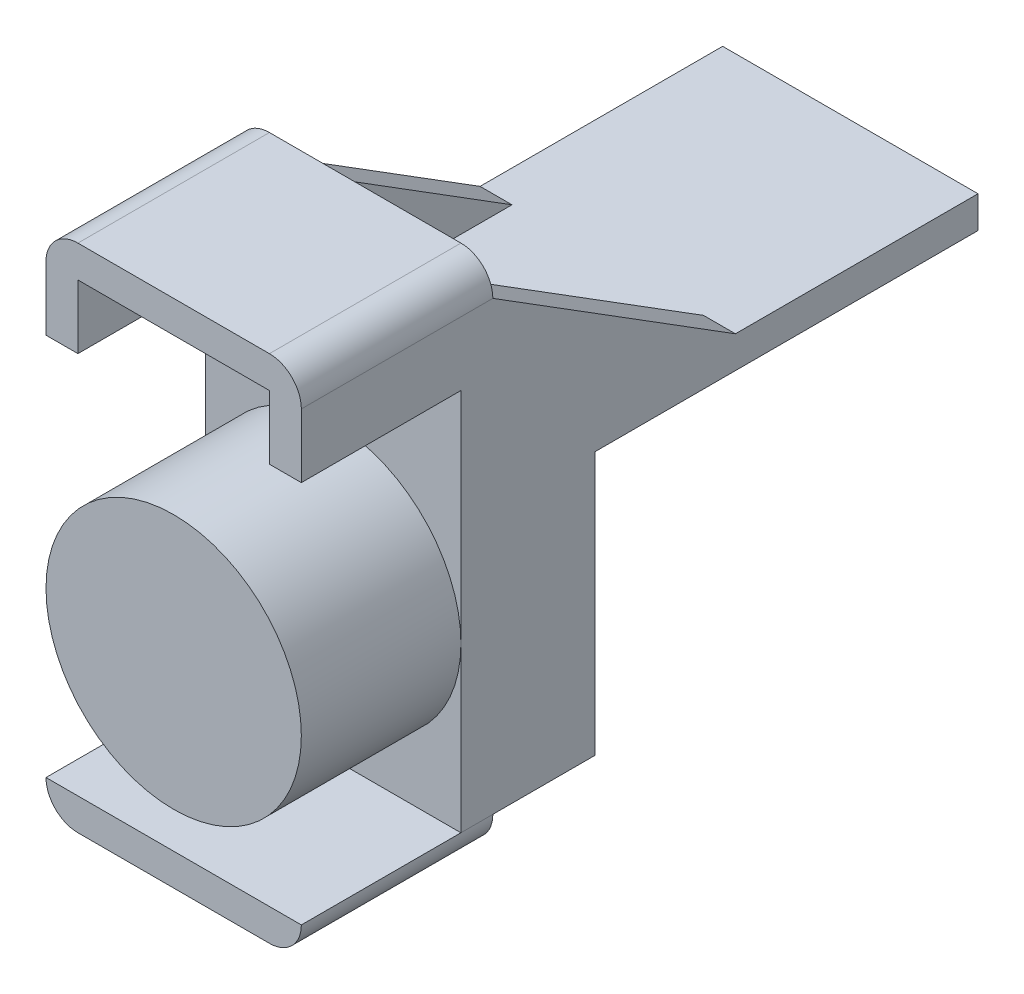
ISO-10303-21;
HEADER;
FILE_DESCRIPTION(('STEP AP214'),'2;1');
FILE_NAME('part.step','',(''),(''),'','','');
FILE_SCHEMA(('AUTOMOTIVE_DESIGN { 1 0 10303 214 1 1 1 1 }'));
ENDSEC;
DATA;
#1=APPLICATION_CONTEXT('core data for automotive mechanical design processes');
#2=APPLICATION_PROTOCOL_DEFINITION('international standard','automotive_design',2000,#1);
#3=PRODUCT_CONTEXT('',#1,'mechanical');
#4=PRODUCT('Part','Part','',(#3));
#5=PRODUCT_RELATED_PRODUCT_CATEGORY('part','',(#4));
#6=PRODUCT_DEFINITION_FORMATION('','',#4);
#7=PRODUCT_DEFINITION_CONTEXT('part definition',#1,'design');
#8=PRODUCT_DEFINITION('design','',#6,#7);
#9=PRODUCT_DEFINITION_SHAPE('','',#8);
#10=(LENGTH_UNIT() NAMED_UNIT(*) SI_UNIT(.MILLI.,.METRE.));
#11=(NAMED_UNIT(*) PLANE_ANGLE_UNIT() SI_UNIT($,.RADIAN.));
#12=(NAMED_UNIT(*) SI_UNIT($,.STERADIAN.) SOLID_ANGLE_UNIT());
#13=UNCERTAINTY_MEASURE_WITH_UNIT(LENGTH_MEASURE(1.E-05),#10,'distance_accuracy_value','');
#14=(GEOMETRIC_REPRESENTATION_CONTEXT(3) GLOBAL_UNCERTAINTY_ASSIGNED_CONTEXT((#13)) GLOBAL_UNIT_ASSIGNED_CONTEXT((#10,
#11,#12)) REPRESENTATION_CONTEXT('',''));
#15=CARTESIAN_POINT('',(0.,0.,0.));
#16=DIRECTION('',(0.,0.,1.));
#17=DIRECTION('',(1.,0.,0.));
#18=AXIS2_PLACEMENT_3D('',#15,#16,#17);
#19=CARTESIAN_POINT('',(0.,0.,-16.));
#20=DIRECTION('',(0.,0.,-1.));
#21=DIRECTION('',(-1.,0.,0.));
#22=AXIS2_PLACEMENT_3D('',#19,#20,#21);
#23=PLANE('',#22);
#24=DIRECTION('',(-1.,0.,0.));
#25=VECTOR('',#24,1.);
#26=CARTESIAN_POINT('',(0.,-33.8044421768255,-16.));
#27=LINE('',#26,#25);
#28=CARTESIAN_POINT('',(40.,-33.8044421768255,-16.));
#29=VERTEX_POINT('',#28);
#30=CARTESIAN_POINT('',(35.,-33.8044421768255,-16.));
#31=VERTEX_POINT('',#30);
#32=EDGE_CURVE('E50',#29,#31,#27,.T.);
#33=ORIENTED_EDGE('',*,*,#32,.F.);
#34=DIRECTION('',(0.,-1.,0.));
#35=VECTOR('',#34,1.);
#36=CARTESIAN_POINT('',(40.,0.,-16.));
#37=LINE('',#36,#35);
#38=CARTESIAN_POINT('',(40.,-75.,-16.));
#39=VERTEX_POINT('',#38);
#40=EDGE_CURVE('E259',#29,#39,#37,.T.);
#41=ORIENTED_EDGE('',*,*,#40,.T.);
#42=DIRECTION('',(1.,0.,0.));
#43=VECTOR('',#42,1.);
#44=CARTESIAN_POINT('',(0.,-75.,-16.));
#45=LINE('',#44,#43);
#46=CARTESIAN_POINT('',(35.,-75.,-16.));
#47=VERTEX_POINT('',#46);
#48=EDGE_CURVE('E246',#47,#39,#45,.T.);
#49=ORIENTED_EDGE('',*,*,#48,.F.);
#50=DIRECTION('',(0.,-1.,0.));
#51=VECTOR('',#50,1.);
#52=CARTESIAN_POINT('',(35.,0.,-16.));
#53=LINE('',#52,#51);
#54=EDGE_CURVE('E250',#31,#47,#53,.T.);
#55=ORIENTED_EDGE('',*,*,#54,.F.);
#56=EDGE_LOOP('',(#33,#41,#49,#55));
#57=FACE_BOUND('',#56,.T.);
#58=ADVANCED_FACE('F39',(#57),#23,.T.);
#59=CARTESIAN_POINT('',(0.,0.,0.));
#60=DIRECTION('',(0.,0.,1.));
#61=DIRECTION('',(1.,0.,0.));
#62=AXIS2_PLACEMENT_3D('',#59,#60,#61);
#63=PLANE('',#62);
#64=DIRECTION('',(0.,1.,0.));
#65=VECTOR('',#64,1.);
#66=CARTESIAN_POINT('',(5.,-5.,0.));
#67=LINE('',#66,#65);
#68=CARTESIAN_POINT('',(5.,-28.8044421768255,0.));
#69=VERTEX_POINT('',#68);
#70=CARTESIAN_POINT('',(5.,-5.,0.));
#71=VERTEX_POINT('',#70);
#72=EDGE_CURVE('E57',#69,#71,#67,.T.);
#73=ORIENTED_EDGE('',*,*,#72,.T.);
#74=DIRECTION('',(-1.,0.,0.));
#75=VECTOR('',#74,1.);
#76=CARTESIAN_POINT('',(5.,-5.,0.));
#77=LINE('',#76,#75);
#78=CARTESIAN_POINT('',(0.,-5.,0.));
#79=VERTEX_POINT('',#78);
#80=EDGE_CURVE('E464',#71,#79,#77,.T.);
#81=ORIENTED_EDGE('',*,*,#80,.T.);
#82=CARTESIAN_POINT('',(5.,-5.,0.));
#83=DIRECTION('',(0.,0.,1.));
#84=DIRECTION('',(1.,0.,0.));
#85=AXIS2_PLACEMENT_3D('',#82,#83,#84);
#86=CIRCLE('',#85,5.);
#87=CARTESIAN_POINT('',(5.,0.,0.));
#88=VERTEX_POINT('',#87);
#89=EDGE_CURVE('E364',#79,#88,#86,.F.);
#90=ORIENTED_EDGE('',*,*,#89,.T.);
#91=DIRECTION('',(1.,0.,0.));
#92=VECTOR('',#91,1.);
#93=CARTESIAN_POINT('',(0.,0.,0.));
#94=LINE('',#93,#92);
#95=CARTESIAN_POINT('',(35.,0.,0.));
#96=VERTEX_POINT('',#95);
#97=EDGE_CURVE('E315',#88,#96,#94,.T.);
#98=ORIENTED_EDGE('',*,*,#97,.T.);
#99=CARTESIAN_POINT('',(35.,-5.,0.));
#100=DIRECTION('',(0.,0.,1.));
#101=DIRECTION('',(1.,0.,0.));
#102=AXIS2_PLACEMENT_3D('',#99,#100,#101);
#103=CIRCLE('',#102,5.);
#104=CARTESIAN_POINT('',(40.,-5.,0.));
#105=VERTEX_POINT('',#104);
#106=EDGE_CURVE('E354',#96,#105,#103,.F.);
#107=ORIENTED_EDGE('',*,*,#106,.T.);
#108=DIRECTION('',(1.,0.,0.));
#109=VECTOR('',#108,1.);
#110=CARTESIAN_POINT('',(35.,-5.,0.));
#111=LINE('',#110,#109);
#112=CARTESIAN_POINT('',(35.,-5.,0.));
#113=VERTEX_POINT('',#112);
#114=EDGE_CURVE('E241',#113,#105,#111,.T.);
#115=ORIENTED_EDGE('',*,*,#114,.F.);
#116=DIRECTION('',(0.,-1.,0.));
#117=VECTOR('',#116,1.);
#118=CARTESIAN_POINT('',(35.,-28.8044421768255,0.));
#119=LINE('',#118,#117);
#120=CARTESIAN_POINT('',(35.,-28.8044421768255,0.));
#121=VERTEX_POINT('',#120);
#122=EDGE_CURVE('E231',#113,#121,#119,.T.);
#123=ORIENTED_EDGE('',*,*,#122,.T.);
#124=DIRECTION('',(-1.,0.,0.));
#125=VECTOR('',#124,1.);
#126=CARTESIAN_POINT('',(0.,-28.8044421768255,0.));
#127=LINE('',#126,#125);
#128=EDGE_CURVE('E239',#121,#69,#127,.T.);
#129=ORIENTED_EDGE('',*,*,#128,.T.);
#130=EDGE_LOOP('',(#73,#81,#90,#98,#107,#115,#123,#129));
#131=FACE_BOUND('',#130,.T.);
#132=ADVANCED_FACE('F238',(#131),#63,.F.);
#133=CARTESIAN_POINT('',(0.,0.,5.));
#134=DIRECTION('',(0.,0.,1.));
#135=DIRECTION('',(1.,0.,0.));
#136=AXIS2_PLACEMENT_3D('',#133,#134,#135);
#137=PLANE('',#136);
#138=CARTESIAN_POINT('',(20.,-49.3296315193119,5.));
#139=DIRECTION('',(0.,0.,1.));
#140=DIRECTION('',(1.,0.,0.));
#141=AXIS2_PLACEMENT_3D('',#138,#139,#140);
#142=CIRCLE('',#141,20.);
#143=CARTESIAN_POINT('',(40.,-49.3296315193119,5.));
#144=VERTEX_POINT('',#143);
#145=CARTESIAN_POINT('',(0.,-49.3296315193119,5.));
#146=VERTEX_POINT('',#145);
#147=EDGE_CURVE('E48',#144,#146,#142,.T.);
#148=ORIENTED_EDGE('',*,*,#147,.F.);
#149=DIRECTION('',(0.,-1.,0.));
#150=VECTOR('',#149,1.);
#151=CARTESIAN_POINT('',(40.,0.,5.));
#152=LINE('',#151,#150);
#153=CARTESIAN_POINT('',(40.,-15.,5.));
#154=VERTEX_POINT('',#153);
#155=EDGE_CURVE('E288',#154,#144,#152,.T.);
#156=ORIENTED_EDGE('',*,*,#155,.F.);
#157=DIRECTION('',(1.,0.,0.));
#158=VECTOR('',#157,1.);
#159=CARTESIAN_POINT('',(-19.,-15.,5.));
#160=LINE('',#159,#158);
#161=CARTESIAN_POINT('',(35.,-15.,5.));
#162=VERTEX_POINT('',#161);
#163=EDGE_CURVE('E291',#162,#154,#160,.T.);
#164=ORIENTED_EDGE('',*,*,#163,.F.);
#165=DIRECTION('',(0.,-1.,0.));
#166=VECTOR('',#165,1.);
#167=CARTESIAN_POINT('',(35.,0.,5.));
#168=LINE('',#167,#166);
#169=CARTESIAN_POINT('',(35.,-5.,5.));
#170=VERTEX_POINT('',#169);
#171=EDGE_CURVE('E310',#170,#162,#168,.T.);
#172=ORIENTED_EDGE('',*,*,#171,.F.);
#173=DIRECTION('',(1.,0.,0.));
#174=VECTOR('',#173,1.);
#175=CARTESIAN_POINT('',(0.,-5.,5.));
#176=LINE('',#175,#174);
#177=CARTESIAN_POINT('',(5.,-5.,5.));
#178=VERTEX_POINT('',#177);
#179=EDGE_CURVE('E313',#178,#170,#176,.T.);
#180=ORIENTED_EDGE('',*,*,#179,.F.);
#181=DIRECTION('',(0.,-1.,0.));
#182=VECTOR('',#181,1.);
#183=CARTESIAN_POINT('',(5.,0.,5.));
#184=LINE('',#183,#182);
#185=CARTESIAN_POINT('',(5.,-15.,5.));
#186=VERTEX_POINT('',#185);
#187=EDGE_CURVE('E348',#178,#186,#184,.T.);
#188=ORIENTED_EDGE('',*,*,#187,.T.);
#189=CARTESIAN_POINT('',(0.,-15.,5.));
#190=VERTEX_POINT('',#189);
#191=EDGE_CURVE('E293',#190,#186,#160,.T.);
#192=ORIENTED_EDGE('',*,*,#191,.F.);
#193=DIRECTION('',(0.,-1.,0.));
#194=VECTOR('',#193,1.);
#195=CARTESIAN_POINT('',(0.,0.,5.));
#196=LINE('',#195,#194);
#197=EDGE_CURVE('E305',#190,#146,#196,.T.);
#198=ORIENTED_EDGE('',*,*,#197,.T.);
#199=EDGE_LOOP('',(#148,#156,#164,#172,#180,#188,#192,#198));
#200=FACE_BOUND('',#199,.T.);
#201=ADVANCED_FACE('F401',(#200),#137,.T.);
#202=CARTESIAN_POINT('',(35.,0.,30.));
#203=DIRECTION('',(1.,0.,0.));
#204=DIRECTION('',(0.,0.,-1.));
#205=AXIS2_PLACEMENT_3D('',#202,#203,#204);
#206=PLANE('',#205);
#207=DIRECTION('',(0.,0.,-1.));
#208=VECTOR('',#207,1.);
#209=CARTESIAN_POINT('',(35.,-15.,30.));
#210=LINE('',#209,#208);
#211=CARTESIAN_POINT('',(35.,-15.,30.));
#212=VERTEX_POINT('',#211);
#213=EDGE_CURVE('E302',#212,#162,#210,.T.);
#214=ORIENTED_EDGE('',*,*,#213,.F.);
#215=DIRECTION('',(0.,-1.,0.));
#216=VECTOR('',#215,1.);
#217=CARTESIAN_POINT('',(35.,0.,30.));
#218=LINE('',#217,#216);
#219=CARTESIAN_POINT('',(35.,-5.,30.));
#220=VERTEX_POINT('',#219);
#221=EDGE_CURVE('E331',#220,#212,#218,.T.);
#222=ORIENTED_EDGE('',*,*,#221,.F.);
#223=DIRECTION('',(0.,0.,-1.));
#224=VECTOR('',#223,1.);
#225=CARTESIAN_POINT('',(35.,-5.,30.));
#226=LINE('',#225,#224);
#227=EDGE_CURVE('E345',#220,#170,#226,.T.);
#228=ORIENTED_EDGE('',*,*,#227,.T.);
#229=ORIENTED_EDGE('',*,*,#171,.T.);
#230=EDGE_LOOP('',(#214,#222,#228,#229));
#231=FACE_BOUND('',#230,.T.);
#232=ADVANCED_FACE('F443',(#231),#206,.F.);
#233=CARTESIAN_POINT('',(40.,0.,30.));
#234=DIRECTION('',(1.,0.,0.));
#235=DIRECTION('',(0.,1.,0.));
#236=AXIS2_PLACEMENT_3D('',#233,#234,#235);
#237=PLANE('',#236);
#238=CARTESIAN_POINT('',(40.,-75.,5.));
#239=VERTEX_POINT('',#238);
#240=EDGE_CURVE('E287',#144,#239,#152,.T.);
#241=ORIENTED_EDGE('',*,*,#240,.T.);
#242=DIRECTION('',(0.,0.,-1.));
#243=VECTOR('',#242,1.);
#244=CARTESIAN_POINT('',(40.,-75.,0.));
#245=LINE('',#244,#243);
#246=CARTESIAN_POINT('',(40.,-75.,0.));
#247=VERTEX_POINT('',#246);
#248=EDGE_CURVE('E381',#239,#247,#245,.T.);
#249=ORIENTED_EDGE('',*,*,#248,.T.);
#250=DIRECTION('',(0.,0.,1.));
#251=VECTOR('',#250,1.);
#252=CARTESIAN_POINT('',(40.,-75.,-16.));
#253=LINE('',#252,#251);
#254=EDGE_CURVE('E256',#39,#247,#253,.T.);
#255=ORIENTED_EDGE('',*,*,#254,.F.);
#256=ORIENTED_EDGE('',*,*,#40,.F.);
#257=DIRECTION('',(0.,0.,1.));
#258=VECTOR('',#257,1.);
#259=CARTESIAN_POINT('',(40.,-33.8044421768255,-76.));
#260=LINE('',#259,#258);
#261=CARTESIAN_POINT('',(40.,-33.8044421768255,-76.));
#262=VERTEX_POINT('',#261);
#263=EDGE_CURVE('E496',#262,#29,#260,.T.);
#264=ORIENTED_EDGE('',*,*,#263,.F.);
#265=DIRECTION('',(0.,-1.,0.));
#266=VECTOR('',#265,1.);
#267=CARTESIAN_POINT('',(40.,-33.8044421768255,-76.));
#268=LINE('',#267,#266);
#269=CARTESIAN_POINT('',(40.,-28.8044421768255,-76.));
#270=VERTEX_POINT('',#269);
#271=EDGE_CURVE('E481',#270,#262,#268,.T.);
#272=ORIENTED_EDGE('',*,*,#271,.F.);
#273=DIRECTION('',(0.,0.,1.));
#274=VECTOR('',#273,1.);
#275=CARTESIAN_POINT('',(40.,-28.8044421768255,-16.));
#276=LINE('',#275,#274);
#277=CARTESIAN_POINT('',(40.,-28.8044421768255,-38.));
#278=VERTEX_POINT('',#277);
#279=EDGE_CURVE('E258',#270,#278,#276,.T.);
#280=ORIENTED_EDGE('',*,*,#279,.T.);
#281=DIRECTION('',(0.,0.530871745146569,0.84745217576276));
#282=VECTOR('',#281,1.);
#283=CARTESIAN_POINT('',(40.,-5.,0.));
#284=LINE('',#283,#282);
#285=EDGE_CURVE('E242',#278,#105,#284,.T.);
#286=ORIENTED_EDGE('',*,*,#285,.T.);
#287=DIRECTION('',(0.,0.,-1.));
#288=VECTOR('',#287,1.);
#289=CARTESIAN_POINT('',(40.,-5.,30.));
#290=LINE('',#289,#288);
#291=CARTESIAN_POINT('',(40.,-5.,30.));
#292=VERTEX_POINT('',#291);
#293=EDGE_CURVE('E356',#105,#292,#290,.F.);
#294=ORIENTED_EDGE('',*,*,#293,.T.);
#295=DIRECTION('',(0.,-1.,0.));
#296=VECTOR('',#295,1.);
#297=CARTESIAN_POINT('',(40.,0.,30.));
#298=LINE('',#297,#296);
#299=CARTESIAN_POINT('',(40.,-15.,30.));
#300=VERTEX_POINT('',#299);
#301=EDGE_CURVE('E316',#292,#300,#298,.T.);
#302=ORIENTED_EDGE('',*,*,#301,.T.);
#303=DIRECTION('',(0.,0.,-1.));
#304=VECTOR('',#303,1.);
#305=CARTESIAN_POINT('',(40.,-15.,0.));
#306=LINE('',#305,#304);
#307=EDGE_CURVE('E284',#300,#154,#306,.T.);
#308=ORIENTED_EDGE('',*,*,#307,.T.);
#309=ORIENTED_EDGE('',*,*,#155,.T.);
#310=EDGE_LOOP('',(#241,#249,#255,#256,#264,#272,#280,#286,#294,#302,#308,#309));
#311=FACE_BOUND('',#310,.T.);
#312=ADVANCED_FACE('F430',(#311),#237,.T.);
#313=CARTESIAN_POINT('',(0.,0.,30.));
#314=DIRECTION('',(1.,0.,0.));
#315=DIRECTION('',(0.,1.,0.));
#316=AXIS2_PLACEMENT_3D('',#313,#314,#315);
#317=PLANE('',#316);
#318=DIRECTION('',(0.,0.,-1.));
#319=VECTOR('',#318,1.);
#320=CARTESIAN_POINT('',(0.,-75.,30.));
#321=LINE('',#320,#319);
#322=CARTESIAN_POINT('',(0.,-75.,0.));
#323=VERTEX_POINT('',#322);
#324=CARTESIAN_POINT('',(0.,-75.,5.));
#325=VERTEX_POINT('',#324);
#326=EDGE_CURVE('E376',#323,#325,#321,.F.);
#327=ORIENTED_EDGE('',*,*,#326,.T.);
#328=EDGE_CURVE('E304',#146,#325,#196,.T.);
#329=ORIENTED_EDGE('',*,*,#328,.F.);
#330=ORIENTED_EDGE('',*,*,#197,.F.);
#331=DIRECTION('',(0.,0.,-1.));
#332=VECTOR('',#331,1.);
#333=CARTESIAN_POINT('',(0.,-15.,30.));
#334=LINE('',#333,#332);
#335=CARTESIAN_POINT('',(0.,-15.,30.));
#336=VERTEX_POINT('',#335);
#337=EDGE_CURVE('E300',#336,#190,#334,.T.);
#338=ORIENTED_EDGE('',*,*,#337,.F.);
#339=DIRECTION('',(0.,-1.,0.));
#340=VECTOR('',#339,1.);
#341=CARTESIAN_POINT('',(0.,0.,30.));
#342=LINE('',#341,#340);
#343=CARTESIAN_POINT('',(0.,-5.,30.));
#344=VERTEX_POINT('',#343);
#345=EDGE_CURVE('E322',#344,#336,#342,.T.);
#346=ORIENTED_EDGE('',*,*,#345,.F.);
#347=DIRECTION('',(0.,0.,-1.));
#348=VECTOR('',#347,1.);
#349=CARTESIAN_POINT('',(0.,-5.,0.));
#350=LINE('',#349,#348);
#351=EDGE_CURVE('E361',#344,#79,#350,.T.);
#352=ORIENTED_EDGE('',*,*,#351,.T.);
#353=DIRECTION('',(0.,-0.530871745146569,-0.84745217576276));
#354=VECTOR('',#353,1.);
#355=CARTESIAN_POINT('',(0.,-28.8044421768255,-38.));
#356=LINE('',#355,#354);
#357=CARTESIAN_POINT('',(0.,-28.8044421768255,-38.));
#358=VERTEX_POINT('',#357);
#359=EDGE_CURVE('E594',#79,#358,#356,.T.);
#360=ORIENTED_EDGE('',*,*,#359,.T.);
#361=DIRECTION('',(0.,0.,1.));
#362=VECTOR('',#361,1.);
#363=CARTESIAN_POINT('',(0.,-28.8044421768255,-16.));
#364=LINE('',#363,#362);
#365=CARTESIAN_POINT('',(0.,-28.8044421768255,-76.));
#366=VERTEX_POINT('',#365);
#367=EDGE_CURVE('E262',#366,#358,#364,.T.);
#368=ORIENTED_EDGE('',*,*,#367,.F.);
#369=DIRECTION('',(0.,1.,0.));
#370=VECTOR('',#369,1.);
#371=CARTESIAN_POINT('',(0.,-28.8044421768255,-76.));
#372=LINE('',#371,#370);
#373=CARTESIAN_POINT('',(0.,-33.8044421768255,-76.));
#374=VERTEX_POINT('',#373);
#375=EDGE_CURVE('E486',#374,#366,#372,.T.);
#376=ORIENTED_EDGE('',*,*,#375,.F.);
#377=DIRECTION('',(0.,0.,1.));
#378=VECTOR('',#377,1.);
#379=CARTESIAN_POINT('',(0.,-33.8044421768255,-76.));
#380=LINE('',#379,#378);
#381=CARTESIAN_POINT('',(0.,-33.8044421768255,-16.));
#382=VERTEX_POINT('',#381);
#383=EDGE_CURVE('E491',#374,#382,#380,.T.);
#384=ORIENTED_EDGE('',*,*,#383,.T.);
#385=DIRECTION('',(0.,1.,0.));
#386=VECTOR('',#385,1.);
#387=CARTESIAN_POINT('',(0.,0.,-16.));
#388=LINE('',#387,#386);
#389=CARTESIAN_POINT('',(0.,-75.,-16.));
#390=VERTEX_POINT('',#389);
#391=EDGE_CURVE('E506',#390,#382,#388,.T.);
#392=ORIENTED_EDGE('',*,*,#391,.F.);
#393=DIRECTION('',(0.,0.,1.));
#394=VECTOR('',#393,1.);
#395=CARTESIAN_POINT('',(0.,-75.,-16.));
#396=LINE('',#395,#394);
#397=EDGE_CURVE('E264',#390,#323,#396,.T.);
#398=ORIENTED_EDGE('',*,*,#397,.T.);
#399=EDGE_LOOP('',(#327,#329,#330,#338,#346,#352,#360,#368,#376,#384,#392,#398));
#400=FACE_BOUND('',#399,.T.);
#401=ADVANCED_FACE('F408',(#400),#317,.F.);
#402=CARTESIAN_POINT('',(5.,0.,30.));
#403=DIRECTION('',(1.,0.,0.));
#404=DIRECTION('',(0.,1.,0.));
#405=AXIS2_PLACEMENT_3D('',#402,#403,#404);
#406=PLANE('',#405);
#407=DIRECTION('',(0.,-1.,0.));
#408=VECTOR('',#407,1.);
#409=CARTESIAN_POINT('',(5.,0.,30.));
#410=LINE('',#409,#408);
#411=CARTESIAN_POINT('',(5.,-5.,30.));
#412=VERTEX_POINT('',#411);
#413=CARTESIAN_POINT('',(5.,-15.,30.));
#414=VERTEX_POINT('',#413);
#415=EDGE_CURVE('E336',#412,#414,#410,.T.);
#416=ORIENTED_EDGE('',*,*,#415,.T.);
#417=DIRECTION('',(0.,0.,-1.));
#418=VECTOR('',#417,1.);
#419=CARTESIAN_POINT('',(5.,-15.,30.));
#420=LINE('',#419,#418);
#421=EDGE_CURVE('E297',#414,#186,#420,.T.);
#422=ORIENTED_EDGE('',*,*,#421,.T.);
#423=ORIENTED_EDGE('',*,*,#187,.F.);
#424=DIRECTION('',(0.,0.,-1.));
#425=VECTOR('',#424,1.);
#426=CARTESIAN_POINT('',(5.,-5.,30.));
#427=LINE('',#426,#425);
#428=EDGE_CURVE('E339',#412,#178,#427,.T.);
#429=ORIENTED_EDGE('',*,*,#428,.F.);
#430=EDGE_LOOP('',(#416,#422,#423,#429));
#431=FACE_BOUND('',#430,.T.);
#432=ADVANCED_FACE('F449',(#431),#406,.T.);
#433=CARTESIAN_POINT('',(0.,0.,30.));
#434=DIRECTION('',(0.,0.,1.));
#435=DIRECTION('',(1.,0.,0.));
#436=AXIS2_PLACEMENT_3D('',#433,#434,#435);
#437=PLANE('',#436);
#438=ORIENTED_EDGE('',*,*,#345,.T.);
#439=DIRECTION('',(1.,0.,0.));
#440=VECTOR('',#439,1.);
#441=CARTESIAN_POINT('',(-19.,-15.,30.));
#442=LINE('',#441,#440);
#443=EDGE_CURVE('E294',#336,#414,#442,.T.);
#444=ORIENTED_EDGE('',*,*,#443,.T.);
#445=ORIENTED_EDGE('',*,*,#415,.F.);
#446=DIRECTION('',(1.,0.,0.));
#447=VECTOR('',#446,1.);
#448=CARTESIAN_POINT('',(0.,-5.,30.));
#449=LINE('',#448,#447);
#450=EDGE_CURVE('E328',#412,#220,#449,.T.);
#451=ORIENTED_EDGE('',*,*,#450,.T.);
#452=ORIENTED_EDGE('',*,*,#221,.T.);
#453=EDGE_CURVE('E290',#212,#300,#442,.T.);
#454=ORIENTED_EDGE('',*,*,#453,.T.);
#455=ORIENTED_EDGE('',*,*,#301,.F.);
#456=CARTESIAN_POINT('',(35.,-5.,30.));
#457=DIRECTION('',(0.,0.,1.));
#458=DIRECTION('',(1.,0.,0.));
#459=AXIS2_PLACEMENT_3D('',#456,#457,#458);
#460=CIRCLE('',#459,5.);
#461=CARTESIAN_POINT('',(35.,0.,30.));
#462=VERTEX_POINT('',#461);
#463=EDGE_CURVE('E358',#292,#462,#460,.T.);
#464=ORIENTED_EDGE('',*,*,#463,.T.);
#465=DIRECTION('',(1.,0.,0.));
#466=VECTOR('',#465,1.);
#467=CARTESIAN_POINT('',(0.,0.,30.));
#468=LINE('',#467,#466);
#469=CARTESIAN_POINT('',(5.,0.,30.));
#470=VERTEX_POINT('',#469);
#471=EDGE_CURVE('E319',#470,#462,#468,.T.);
#472=ORIENTED_EDGE('',*,*,#471,.F.);
#473=CARTESIAN_POINT('',(5.,-5.,30.));
#474=DIRECTION('',(0.,0.,1.));
#475=DIRECTION('',(1.,0.,0.));
#476=AXIS2_PLACEMENT_3D('',#473,#474,#475);
#477=CIRCLE('',#476,5.);
#478=EDGE_CURVE('E368',#470,#344,#477,.T.);
#479=ORIENTED_EDGE('',*,*,#478,.T.);
#480=EDGE_LOOP('',(#438,#444,#445,#451,#452,#454,#455,#464,#472,#479));
#481=FACE_BOUND('',#480,.T.);
#482=ADVANCED_FACE('F437',(#481),#437,.T.);
#483=DIRECTION('',(-1.,0.,0.));
#484=VECTOR('',#483,1.);
#485=CARTESIAN_POINT('',(0.,-75.,30.));
#486=LINE('',#485,#484);
#487=CARTESIAN_POINT('',(40.,-75.,30.));
#488=VERTEX_POINT('',#487);
#489=CARTESIAN_POINT('',(0.,-75.,30.));
#490=VERTEX_POINT('',#489);
#491=EDGE_CURVE('E334',#488,#490,#486,.T.);
#492=ORIENTED_EDGE('',*,*,#491,.T.);
#493=CARTESIAN_POINT('',(5.00000000000001,-75.,30.));
#494=DIRECTION('',(0.,0.,1.));
#495=DIRECTION('',(1.,0.,0.));
#496=AXIS2_PLACEMENT_3D('',#493,#494,#495);
#497=CIRCLE('',#496,5.);
#498=CARTESIAN_POINT('',(5.00000000000001,-80.,30.));
#499=VERTEX_POINT('',#498);
#500=EDGE_CURVE('E379',#490,#499,#497,.T.);
#501=ORIENTED_EDGE('',*,*,#500,.T.);
#502=DIRECTION('',(1.,0.,0.));
#503=VECTOR('',#502,1.);
#504=CARTESIAN_POINT('',(0.,-80.,30.));
#505=LINE('',#504,#503);
#506=CARTESIAN_POINT('',(35.,-80.,30.));
#507=VERTEX_POINT('',#506);
#508=EDGE_CURVE('E325',#499,#507,#505,.T.);
#509=ORIENTED_EDGE('',*,*,#508,.T.);
#510=CARTESIAN_POINT('',(35.,-75.,30.));
#511=DIRECTION('',(0.,0.,1.));
#512=DIRECTION('',(1.,0.,0.));
#513=AXIS2_PLACEMENT_3D('',#510,#511,#512);
#514=CIRCLE('',#513,5.);
#515=EDGE_CURVE('E388',#507,#488,#514,.T.);
#516=ORIENTED_EDGE('',*,*,#515,.T.);
#517=EDGE_LOOP('',(#492,#501,#509,#516));
#518=FACE_BOUND('',#517,.T.);
#519=ADVANCED_FACE('F533',(#518),#437,.T.);
#520=CARTESIAN_POINT('',(0.,-5.,30.));
#521=DIRECTION('',(0.,1.,0.));
#522=DIRECTION('',(0.,0.,1.));
#523=AXIS2_PLACEMENT_3D('',#520,#521,#522);
#524=PLANE('',#523);
#525=ORIENTED_EDGE('',*,*,#428,.T.);
#526=ORIENTED_EDGE('',*,*,#179,.T.);
#527=ORIENTED_EDGE('',*,*,#227,.F.);
#528=ORIENTED_EDGE('',*,*,#450,.F.);
#529=EDGE_LOOP('',(#525,#526,#527,#528));
#530=FACE_BOUND('',#529,.T.);
#531=ADVANCED_FACE('F447',(#530),#524,.F.);
#532=CARTESIAN_POINT('',(0.,-75.,30.));
#533=DIRECTION('',(0.,-1.,0.));
#534=DIRECTION('',(0.,0.,-1.));
#535=AXIS2_PLACEMENT_3D('',#532,#533,#534);
#536=PLANE('',#535);
#537=DIRECTION('',(0.,0.,1.));
#538=VECTOR('',#537,1.);
#539=CARTESIAN_POINT('',(0.,-75.,0.));
#540=LINE('',#539,#538);
#541=EDGE_CURVE('E278',#325,#490,#540,.T.);
#542=ORIENTED_EDGE('',*,*,#541,.T.);
#543=ORIENTED_EDGE('',*,*,#491,.F.);
#544=EDGE_CURVE('E382',#488,#239,#245,.T.);
#545=ORIENTED_EDGE('',*,*,#544,.T.);
#546=DIRECTION('',(-1.,0.,0.));
#547=VECTOR('',#546,1.);
#548=CARTESIAN_POINT('',(0.,-75.,5.));
#549=LINE('',#548,#547);
#550=EDGE_CURVE('E308',#239,#325,#549,.T.);
#551=ORIENTED_EDGE('',*,*,#550,.T.);
#552=EDGE_LOOP('',(#542,#543,#545,#551));
#553=FACE_BOUND('',#552,.T.);
#554=ADVANCED_FACE('F422',(#553),#536,.F.);
#555=CARTESIAN_POINT('',(0.,0.,30.));
#556=DIRECTION('',(0.,1.,0.));
#557=DIRECTION('',(0.,0.,1.));
#558=AXIS2_PLACEMENT_3D('',#555,#556,#557);
#559=PLANE('',#558);
#560=ORIENTED_EDGE('',*,*,#97,.F.);
#561=DIRECTION('',(0.,0.,-1.));
#562=VECTOR('',#561,1.);
#563=CARTESIAN_POINT('',(5.,0.,30.));
#564=LINE('',#563,#562);
#565=EDGE_CURVE('E366',#88,#470,#564,.F.);
#566=ORIENTED_EDGE('',*,*,#565,.T.);
#567=ORIENTED_EDGE('',*,*,#471,.T.);
#568=DIRECTION('',(0.,0.,-1.));
#569=VECTOR('',#568,1.);
#570=CARTESIAN_POINT('',(35.,0.,30.));
#571=LINE('',#570,#569);
#572=EDGE_CURVE('E351',#462,#96,#571,.T.);
#573=ORIENTED_EDGE('',*,*,#572,.T.);
#574=EDGE_LOOP('',(#560,#566,#567,#573));
#575=FACE_BOUND('',#574,.T.);
#576=ADVANCED_FACE('F466',(#575),#559,.T.);
#577=CARTESIAN_POINT('',(0.,-80.,30.));
#578=DIRECTION('',(0.,1.,0.));
#579=DIRECTION('',(0.,0.,1.));
#580=AXIS2_PLACEMENT_3D('',#577,#578,#579);
#581=PLANE('',#580);
#582=DIRECTION('',(1.,0.,0.));
#583=VECTOR('',#582,1.);
#584=CARTESIAN_POINT('',(0.,-80.,0.));
#585=LINE('',#584,#583);
#586=CARTESIAN_POINT('',(5.00000000000001,-80.,0.));
#587=VERTEX_POINT('',#586);
#588=CARTESIAN_POINT('',(35.,-80.,0.));
#589=VERTEX_POINT('',#588);
#590=EDGE_CURVE('E320',#587,#589,#585,.T.);
#591=ORIENTED_EDGE('',*,*,#590,.T.);
#592=DIRECTION('',(0.,0.,-1.));
#593=VECTOR('',#592,1.);
#594=CARTESIAN_POINT('',(35.,-80.,30.));
#595=LINE('',#594,#593);
#596=EDGE_CURVE('E387',#589,#507,#595,.F.);
#597=ORIENTED_EDGE('',*,*,#596,.T.);
#598=ORIENTED_EDGE('',*,*,#508,.F.);
#599=DIRECTION('',(0.,0.,-1.));
#600=VECTOR('',#599,1.);
#601=CARTESIAN_POINT('',(5.00000000000001,-80.,30.));
#602=LINE('',#601,#600);
#603=EDGE_CURVE('E370',#499,#587,#602,.T.);
#604=ORIENTED_EDGE('',*,*,#603,.T.);
#605=EDGE_LOOP('',(#591,#597,#598,#604));
#606=FACE_BOUND('',#605,.T.);
#607=ADVANCED_FACE('F532',(#606),#581,.F.);
#608=DIRECTION('',(0.,-1.,0.));
#609=VECTOR('',#608,1.);
#610=CARTESIAN_POINT('',(35.,0.,0.));
#611=LINE('',#610,#609);
#612=CARTESIAN_POINT('',(35.,-33.8044421768255,0.));
#613=VERTEX_POINT('',#612);
#614=CARTESIAN_POINT('',(35.,-75.,0.));
#615=VERTEX_POINT('',#614);
#616=EDGE_CURVE('E511',#613,#615,#611,.T.);
#617=ORIENTED_EDGE('',*,*,#616,.T.);
#618=DIRECTION('',(1.,0.,0.));
#619=VECTOR('',#618,1.);
#620=CARTESIAN_POINT('',(0.,-75.,0.));
#621=LINE('',#620,#619);
#622=EDGE_CURVE('E498',#615,#247,#621,.T.);
#623=ORIENTED_EDGE('',*,*,#622,.T.);
#624=CARTESIAN_POINT('',(35.,-75.,0.));
#625=DIRECTION('',(0.,0.,1.));
#626=DIRECTION('',(1.,0.,0.));
#627=AXIS2_PLACEMENT_3D('',#624,#625,#626);
#628=CIRCLE('',#627,5.);
#629=EDGE_CURVE('E385',#247,#589,#628,.F.);
#630=ORIENTED_EDGE('',*,*,#629,.T.);
#631=ORIENTED_EDGE('',*,*,#590,.F.);
#632=CARTESIAN_POINT('',(5.00000000000001,-75.,0.));
#633=DIRECTION('',(0.,0.,1.));
#634=DIRECTION('',(1.,0.,0.));
#635=AXIS2_PLACEMENT_3D('',#632,#633,#634);
#636=CIRCLE('',#635,5.);
#637=EDGE_CURVE('E373',#587,#323,#636,.F.);
#638=ORIENTED_EDGE('',*,*,#637,.T.);
#639=DIRECTION('',(-1.,0.,0.));
#640=VECTOR('',#639,1.);
#641=CARTESIAN_POINT('',(0.,-75.,0.));
#642=LINE('',#641,#640);
#643=CARTESIAN_POINT('',(5.,-75.,0.));
#644=VERTEX_POINT('',#643);
#645=EDGE_CURVE('E247',#644,#323,#642,.T.);
#646=ORIENTED_EDGE('',*,*,#645,.F.);
#647=DIRECTION('',(0.,-1.,0.));
#648=VECTOR('',#647,1.);
#649=CARTESIAN_POINT('',(4.99999999999999,0.,0.));
#650=LINE('',#649,#648);
#651=CARTESIAN_POINT('',(5.,-33.8044421768255,0.));
#652=VERTEX_POINT('',#651);
#653=EDGE_CURVE('E252',#652,#644,#650,.T.);
#654=ORIENTED_EDGE('',*,*,#653,.F.);
#655=DIRECTION('',(-1.,0.,0.));
#656=VECTOR('',#655,1.);
#657=CARTESIAN_POINT('',(0.,-33.8044421768255,0.));
#658=LINE('',#657,#656);
#659=EDGE_CURVE('E514',#613,#652,#658,.T.);
#660=ORIENTED_EDGE('',*,*,#659,.F.);
#661=EDGE_LOOP('',(#617,#623,#630,#631,#638,#646,#654,#660));
#662=FACE_BOUND('',#661,.T.);
#663=ADVANCED_FACE('F528',(#662),#63,.F.);
#664=ORIENTED_EDGE('',*,*,#328,.T.);
#665=ORIENTED_EDGE('',*,*,#550,.F.);
#666=ORIENTED_EDGE('',*,*,#240,.F.);
#667=EDGE_CURVE('E43',#146,#144,#142,.T.);
#668=ORIENTED_EDGE('',*,*,#667,.F.);
#669=EDGE_LOOP('',(#664,#665,#666,#668));
#670=FACE_BOUND('',#669,.T.);
#671=ADVANCED_FACE('F414',(#670),#137,.T.);
#672=CARTESIAN_POINT('',(35.,-5.,30.));
#673=DIRECTION('',(0.,0.,-1.));
#674=DIRECTION('',(-1.,0.,0.));
#675=AXIS2_PLACEMENT_3D('',#672,#673,#674);
#676=CYLINDRICAL_SURFACE('',#675,5.);
#677=ORIENTED_EDGE('',*,*,#463,.F.);
#678=ORIENTED_EDGE('',*,*,#293,.F.);
#679=ORIENTED_EDGE('',*,*,#106,.F.);
#680=ORIENTED_EDGE('',*,*,#572,.F.);
#681=EDGE_LOOP('',(#677,#678,#679,#680));
#682=FACE_BOUND('',#681,.T.);
#683=ADVANCED_FACE('F469',(#682),#676,.T.);
#684=CARTESIAN_POINT('',(5.,-5.,30.));
#685=DIRECTION('',(0.,0.,1.));
#686=DIRECTION('',(1.,0.,0.));
#687=AXIS2_PLACEMENT_3D('',#684,#685,#686);
#688=CYLINDRICAL_SURFACE('',#687,5.);
#689=ORIENTED_EDGE('',*,*,#478,.F.);
#690=ORIENTED_EDGE('',*,*,#565,.F.);
#691=ORIENTED_EDGE('',*,*,#89,.F.);
#692=ORIENTED_EDGE('',*,*,#351,.F.);
#693=EDGE_LOOP('',(#689,#690,#691,#692));
#694=FACE_BOUND('',#693,.T.);
#695=ADVANCED_FACE('F460',(#694),#688,.T.);
#696=CARTESIAN_POINT('',(5.00000000000001,-75.,30.));
#697=DIRECTION('',(0.,0.,-1.));
#698=DIRECTION('',(-1.,0.,0.));
#699=AXIS2_PLACEMENT_3D('',#696,#697,#698);
#700=CYLINDRICAL_SURFACE('',#699,5.);
#701=ORIENTED_EDGE('',*,*,#500,.F.);
#702=ORIENTED_EDGE('',*,*,#541,.F.);
#703=ORIENTED_EDGE('',*,*,#326,.F.);
#704=ORIENTED_EDGE('',*,*,#637,.F.);
#705=ORIENTED_EDGE('',*,*,#603,.F.);
#706=EDGE_LOOP('',(#701,#702,#703,#704,#705));
#707=FACE_BOUND('',#706,.T.);
#708=ADVANCED_FACE('F419',(#707),#700,.T.);
#709=CARTESIAN_POINT('',(35.,-75.,30.));
#710=DIRECTION('',(0.,0.,1.));
#711=DIRECTION('',(1.,0.,0.));
#712=AXIS2_PLACEMENT_3D('',#709,#710,#711);
#713=CYLINDRICAL_SURFACE('',#712,5.);
#714=ORIENTED_EDGE('',*,*,#515,.F.);
#715=ORIENTED_EDGE('',*,*,#596,.F.);
#716=ORIENTED_EDGE('',*,*,#629,.F.);
#717=ORIENTED_EDGE('',*,*,#248,.F.);
#718=ORIENTED_EDGE('',*,*,#544,.F.);
#719=EDGE_LOOP('',(#714,#715,#716,#717,#718));
#720=FACE_BOUND('',#719,.T.);
#721=ADVANCED_FACE('F41',(#720),#713,.T.);
#722=CARTESIAN_POINT('',(-19.,-15.,0.));
#723=DIRECTION('',(0.,-1.,0.));
#724=DIRECTION('',(1.,0.,0.));
#725=AXIS2_PLACEMENT_3D('',#722,#723,#724);
#726=PLANE('',#725);
#727=ORIENTED_EDGE('',*,*,#337,.T.);
#728=ORIENTED_EDGE('',*,*,#191,.T.);
#729=ORIENTED_EDGE('',*,*,#421,.F.);
#730=ORIENTED_EDGE('',*,*,#443,.F.);
#731=EDGE_LOOP('',(#727,#728,#729,#730));
#732=FACE_BOUND('',#731,.T.);
#733=ADVANCED_FACE('F452',(#732),#726,.T.);
#734=ORIENTED_EDGE('',*,*,#213,.T.);
#735=ORIENTED_EDGE('',*,*,#163,.T.);
#736=ORIENTED_EDGE('',*,*,#307,.F.);
#737=ORIENTED_EDGE('',*,*,#453,.F.);
#738=EDGE_LOOP('',(#734,#735,#736,#737));
#739=FACE_BOUND('',#738,.T.);
#740=ADVANCED_FACE('F434',(#739),#726,.T.);
#741=CARTESIAN_POINT('',(20.,-49.3296315193119,30.));
#742=DIRECTION('',(0.,0.,-1.));
#743=DIRECTION('',(-1.,0.,0.));
#744=AXIS2_PLACEMENT_3D('',#741,#742,#743);
#745=CYLINDRICAL_SURFACE('',#744,20.);
#746=ORIENTED_EDGE('',*,*,#667,.T.);
#747=ORIENTED_EDGE('',*,*,#147,.T.);
#748=EDGE_LOOP('',(#746,#747));
#749=FACE_BOUND('',#748,.T.);
#750=CARTESIAN_POINT('',(20.,-49.3296315193119,30.));
#751=DIRECTION('',(0.,0.,-1.));
#752=DIRECTION('',(-1.,0.,0.));
#753=AXIS2_PLACEMENT_3D('',#750,#751,#752);
#754=CIRCLE('',#753,20.);
#755=CARTESIAN_POINT('',(0.,-49.3296315193119,30.));
#756=VERTEX_POINT('',#755);
#757=EDGE_CURVE('E281',#756,#756,#754,.T.);
#758=ORIENTED_EDGE('',*,*,#757,.T.);
#759=EDGE_LOOP('',(#758));
#760=FACE_BOUND('',#759,.T.);
#761=ADVANCED_FACE('F397',(#749,#760),#745,.T.);
#762=CARTESIAN_POINT('',(20.,-49.3296315193119,30.));
#763=DIRECTION('',(0.,0.,-1.));
#764=DIRECTION('',(-1.,0.,0.));
#765=AXIS2_PLACEMENT_3D('',#762,#763,#764);
#766=PLANE('',#765);
#767=ORIENTED_EDGE('',*,*,#757,.F.);
#768=EDGE_LOOP('',(#767));
#769=FACE_BOUND('',#768,.T.);
#770=ADVANCED_FACE('F683',(#769),#766,.F.);
#771=CARTESIAN_POINT('',(0.,-75.,-16.));
#772=DIRECTION('',(0.,-1.,0.));
#773=DIRECTION('',(0.,0.,-1.));
#774=AXIS2_PLACEMENT_3D('',#771,#772,#773);
#775=PLANE('',#774);
#776=ORIENTED_EDGE('',*,*,#622,.F.);
#777=DIRECTION('',(0.,0.,1.));
#778=VECTOR('',#777,1.);
#779=CARTESIAN_POINT('',(35.,-75.,-16.));
#780=LINE('',#779,#778);
#781=EDGE_CURVE('E275',#47,#615,#780,.T.);
#782=ORIENTED_EDGE('',*,*,#781,.F.);
#783=ORIENTED_EDGE('',*,*,#48,.T.);
#784=ORIENTED_EDGE('',*,*,#254,.T.);
#785=EDGE_LOOP('',(#776,#782,#783,#784));
#786=FACE_BOUND('',#785,.T.);
#787=ADVANCED_FACE('F571',(#786),#775,.T.);
#788=CARTESIAN_POINT('',(35.,0.,-16.));
#789=DIRECTION('',(-1.,0.,0.));
#790=DIRECTION('',(0.,0.,1.));
#791=AXIS2_PLACEMENT_3D('',#788,#789,#790);
#792=PLANE('',#791);
#793=ORIENTED_EDGE('',*,*,#616,.F.);
#794=DIRECTION('',(0.,0.,1.));
#795=VECTOR('',#794,1.);
#796=CARTESIAN_POINT('',(35.,-33.8044421768255,-16.));
#797=LINE('',#796,#795);
#798=EDGE_CURVE('E273',#31,#613,#797,.T.);
#799=ORIENTED_EDGE('',*,*,#798,.F.);
#800=ORIENTED_EDGE('',*,*,#54,.T.);
#801=ORIENTED_EDGE('',*,*,#781,.T.);
#802=EDGE_LOOP('',(#793,#799,#800,#801));
#803=FACE_BOUND('',#802,.T.);
#804=ADVANCED_FACE('F567',(#803),#792,.T.);
#805=CARTESIAN_POINT('',(0.,-33.8044421768255,-16.));
#806=DIRECTION('',(0.,1.,0.));
#807=DIRECTION('',(0.,0.,1.));
#808=AXIS2_PLACEMENT_3D('',#805,#806,#807);
#809=PLANE('',#808);
#810=ORIENTED_EDGE('',*,*,#659,.T.);
#811=DIRECTION('',(0.,0.,1.));
#812=VECTOR('',#811,1.);
#813=CARTESIAN_POINT('',(5.,-33.8044421768255,-16.));
#814=LINE('',#813,#812);
#815=CARTESIAN_POINT('',(5.,-33.8044421768255,-16.));
#816=VERTEX_POINT('',#815);
#817=EDGE_CURVE('E270',#816,#652,#814,.T.);
#818=ORIENTED_EDGE('',*,*,#817,.F.);
#819=EDGE_CURVE('E11',#816,#382,#27,.T.);
#820=ORIENTED_EDGE('',*,*,#819,.T.);
#821=ORIENTED_EDGE('',*,*,#383,.F.);
#822=DIRECTION('',(-1.,0.,0.));
#823=VECTOR('',#822,1.);
#824=CARTESIAN_POINT('',(0.,-33.8044421768255,-76.));
#825=LINE('',#824,#823);
#826=EDGE_CURVE('E484',#262,#374,#825,.T.);
#827=ORIENTED_EDGE('',*,*,#826,.F.);
#828=ORIENTED_EDGE('',*,*,#263,.T.);
#829=ORIENTED_EDGE('',*,*,#32,.T.);
#830=ORIENTED_EDGE('',*,*,#798,.T.);
#831=EDGE_LOOP('',(#810,#818,#820,#821,#827,#828,#829,#830));
#832=FACE_BOUND('',#831,.T.);
#833=ADVANCED_FACE('F564',(#832),#809,.F.);
#834=CARTESIAN_POINT('',(4.99999999999999,0.,-16.));
#835=DIRECTION('',(-1.,0.,0.));
#836=DIRECTION('',(0.,-1.,0.));
#837=AXIS2_PLACEMENT_3D('',#834,#835,#836);
#838=PLANE('',#837);
#839=ORIENTED_EDGE('',*,*,#653,.T.);
#840=DIRECTION('',(0.,0.,1.));
#841=VECTOR('',#840,1.);
#842=CARTESIAN_POINT('',(5.,-75.,-16.));
#843=LINE('',#842,#841);
#844=CARTESIAN_POINT('',(5.,-75.,-16.));
#845=VERTEX_POINT('',#844);
#846=EDGE_CURVE('E267',#845,#644,#843,.T.);
#847=ORIENTED_EDGE('',*,*,#846,.F.);
#848=DIRECTION('',(0.,-1.,0.));
#849=VECTOR('',#848,1.);
#850=CARTESIAN_POINT('',(4.99999999999999,0.,-16.));
#851=LINE('',#850,#849);
#852=EDGE_CURVE('E502',#816,#845,#851,.T.);
#853=ORIENTED_EDGE('',*,*,#852,.F.);
#854=ORIENTED_EDGE('',*,*,#817,.T.);
#855=EDGE_LOOP('',(#839,#847,#853,#854));
#856=FACE_BOUND('',#855,.T.);
#857=ADVANCED_FACE('F518',(#856),#838,.F.);
#858=CARTESIAN_POINT('',(0.,-75.,-16.));
#859=DIRECTION('',(0.,1.,0.));
#860=DIRECTION('',(0.,0.,1.));
#861=AXIS2_PLACEMENT_3D('',#858,#859,#860);
#862=PLANE('',#861);
#863=ORIENTED_EDGE('',*,*,#645,.T.);
#864=ORIENTED_EDGE('',*,*,#397,.F.);
#865=DIRECTION('',(-1.,0.,0.));
#866=VECTOR('',#865,1.);
#867=CARTESIAN_POINT('',(0.,-75.,-16.));
#868=LINE('',#867,#866);
#869=EDGE_CURVE('E504',#845,#390,#868,.T.);
#870=ORIENTED_EDGE('',*,*,#869,.F.);
#871=ORIENTED_EDGE('',*,*,#846,.T.);
#872=EDGE_LOOP('',(#863,#864,#870,#871));
#873=FACE_BOUND('',#872,.T.);
#874=ADVANCED_FACE('F526',(#873),#862,.F.);
#875=CARTESIAN_POINT('',(0.,-28.8044421768255,-16.));
#876=DIRECTION('',(0.,1.,0.));
#877=DIRECTION('',(0.,0.,1.));
#878=AXIS2_PLACEMENT_3D('',#875,#876,#877);
#879=PLANE('',#878);
#880=DIRECTION('',(-1.,0.,0.));
#881=VECTOR('',#880,1.);
#882=CARTESIAN_POINT('',(5.,-28.8044421768255,-38.));
#883=LINE('',#882,#881);
#884=CARTESIAN_POINT('',(5.,-28.8044421768255,-38.));
#885=VERTEX_POINT('',#884);
#886=EDGE_CURVE('E65',#885,#358,#883,.T.);
#887=ORIENTED_EDGE('',*,*,#886,.F.);
#888=DIRECTION('',(0.,0.,1.));
#889=VECTOR('',#888,1.);
#890=CARTESIAN_POINT('',(5.,-28.8044421768255,0.));
#891=LINE('',#890,#889);
#892=EDGE_CURVE('E245',#885,#69,#891,.T.);
#893=ORIENTED_EDGE('',*,*,#892,.T.);
#894=ORIENTED_EDGE('',*,*,#128,.F.);
#895=DIRECTION('',(0.,0.,-1.));
#896=VECTOR('',#895,1.);
#897=CARTESIAN_POINT('',(35.,-28.8044421768255,-38.));
#898=LINE('',#897,#896);
#899=CARTESIAN_POINT('',(35.,-28.8044421768255,-38.));
#900=VERTEX_POINT('',#899);
#901=EDGE_CURVE('E228',#121,#900,#898,.T.);
#902=ORIENTED_EDGE('',*,*,#901,.T.);
#903=DIRECTION('',(1.,0.,0.));
#904=VECTOR('',#903,1.);
#905=CARTESIAN_POINT('',(35.,-28.8044421768255,-38.));
#906=LINE('',#905,#904);
#907=EDGE_CURVE('E479',#900,#278,#906,.T.);
#908=ORIENTED_EDGE('',*,*,#907,.T.);
#909=ORIENTED_EDGE('',*,*,#279,.F.);
#910=DIRECTION('',(1.,0.,0.));
#911=VECTOR('',#910,1.);
#912=CARTESIAN_POINT('',(40.,-28.8044421768255,-76.));
#913=LINE('',#912,#911);
#914=EDGE_CURVE('E489',#366,#270,#913,.T.);
#915=ORIENTED_EDGE('',*,*,#914,.F.);
#916=ORIENTED_EDGE('',*,*,#367,.T.);
#917=EDGE_LOOP('',(#887,#893,#894,#902,#908,#909,#915,#916));
#918=FACE_BOUND('',#917,.T.);
#919=ADVANCED_FACE('F244',(#918),#879,.T.);
#920=ORIENTED_EDGE('',*,*,#819,.F.);
#921=ORIENTED_EDGE('',*,*,#852,.T.);
#922=ORIENTED_EDGE('',*,*,#869,.T.);
#923=ORIENTED_EDGE('',*,*,#391,.T.);
#924=EDGE_LOOP('',(#920,#921,#922,#923));
#925=FACE_BOUND('',#924,.T.);
#926=ADVANCED_FACE('F546',(#925),#23,.T.);
#927=CARTESIAN_POINT('',(0.,0.,-76.));
#928=DIRECTION('',(0.,0.,1.));
#929=DIRECTION('',(1.,0.,0.));
#930=AXIS2_PLACEMENT_3D('',#927,#928,#929);
#931=PLANE('',#930);
#932=ORIENTED_EDGE('',*,*,#271,.T.);
#933=ORIENTED_EDGE('',*,*,#826,.T.);
#934=ORIENTED_EDGE('',*,*,#375,.T.);
#935=ORIENTED_EDGE('',*,*,#914,.T.);
#936=EDGE_LOOP('',(#932,#933,#934,#935));
#937=FACE_BOUND('',#936,.T.);
#938=ADVANCED_FACE('F553',(#937),#931,.F.);
#939=CARTESIAN_POINT('',(35.,-5.,0.));
#940=DIRECTION('',(0.,0.84745217576276,-0.530871745146569));
#941=DIRECTION('',(0.,0.530871745146569,0.84745217576276));
#942=AXIS2_PLACEMENT_3D('',#939,#940,#941);
#943=PLANE('',#942);
#944=ORIENTED_EDGE('',*,*,#285,.F.);
#945=ORIENTED_EDGE('',*,*,#907,.F.);
#946=DIRECTION('',(0.,0.530871745146569,0.84745217576276));
#947=VECTOR('',#946,1.);
#948=CARTESIAN_POINT('',(35.,-5.,0.));
#949=LINE('',#948,#947);
#950=EDGE_CURVE('E233',#900,#113,#949,.T.);
#951=ORIENTED_EDGE('',*,*,#950,.T.);
#952=ORIENTED_EDGE('',*,*,#114,.T.);
#953=EDGE_LOOP('',(#944,#945,#951,#952));
#954=FACE_BOUND('',#953,.T.);
#955=ADVANCED_FACE('F559',(#954),#943,.T.);
#956=CARTESIAN_POINT('',(35.,0.,0.));
#957=DIRECTION('',(1.,0.,0.));
#958=DIRECTION('',(0.,0.,-1.));
#959=AXIS2_PLACEMENT_3D('',#956,#957,#958);
#960=PLANE('',#959);
#961=ORIENTED_EDGE('',*,*,#122,.F.);
#962=ORIENTED_EDGE('',*,*,#950,.F.);
#963=ORIENTED_EDGE('',*,*,#901,.F.);
#964=EDGE_LOOP('',(#961,#962,#963));
#965=FACE_BOUND('',#964,.T.);
#966=ADVANCED_FACE('F230',(#965),#960,.F.);
#967=CARTESIAN_POINT('',(5.,-28.8044421768255,-38.));
#968=DIRECTION('',(0.,0.84745217576276,-0.530871745146569));
#969=DIRECTION('',(0.,0.530871745146569,0.84745217576276));
#970=AXIS2_PLACEMENT_3D('',#967,#968,#969);
#971=PLANE('',#970);
#972=ORIENTED_EDGE('',*,*,#359,.F.);
#973=ORIENTED_EDGE('',*,*,#80,.F.);
#974=DIRECTION('',(0.,-0.530871745146569,-0.84745217576276));
#975=VECTOR('',#974,1.);
#976=CARTESIAN_POINT('',(5.,-28.8044421768255,-38.));
#977=LINE('',#976,#975);
#978=EDGE_CURVE('E593',#71,#885,#977,.T.);
#979=ORIENTED_EDGE('',*,*,#978,.T.);
#980=ORIENTED_EDGE('',*,*,#886,.T.);
#981=EDGE_LOOP('',(#972,#973,#979,#980));
#982=FACE_BOUND('',#981,.T.);
#983=ADVANCED_FACE('F580',(#982),#971,.T.);
#984=CARTESIAN_POINT('',(5.,0.,0.));
#985=DIRECTION('',(-1.,0.,0.));
#986=DIRECTION('',(0.,-1.,0.));
#987=AXIS2_PLACEMENT_3D('',#984,#985,#986);
#988=PLANE('',#987);
#989=ORIENTED_EDGE('',*,*,#892,.F.);
#990=ORIENTED_EDGE('',*,*,#978,.F.);
#991=ORIENTED_EDGE('',*,*,#72,.F.);
#992=EDGE_LOOP('',(#989,#990,#991));
#993=FACE_BOUND('',#992,.T.);
#994=ADVANCED_FACE('F585',(#993),#988,.F.);
#995=CLOSED_SHELL('',(#58,#132,#201,#232,#312,#401,#432,#482,#519,#531,#554,#576,#607,#663,#671,
#683,#695,#708,#721,#733,#740,#761,#770,#787,#804,#833,#857,#874,#919,#926,#938,#955,#966,#983,#994));
#996=MANIFOLD_SOLID_BREP('B2',#995);
#997=ADVANCED_BREP_SHAPE_REPRESENTATION('',(#18,#996),#14);
#998=SHAPE_DEFINITION_REPRESENTATION(#9,#997);
ENDSEC;
END-ISO-10303-21;
